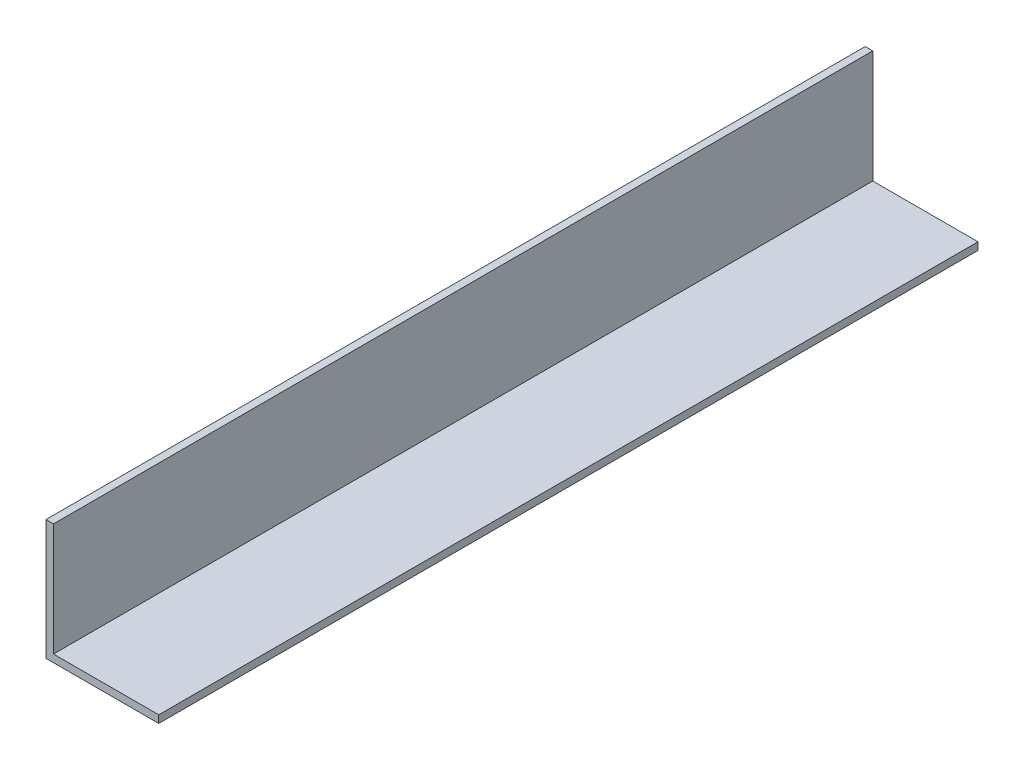
ISO-10303-21;
HEADER;
FILE_DESCRIPTION(('STEP AP214'),'2;1');
FILE_NAME('part.step','',(''),(''),'','','');
FILE_SCHEMA(('AUTOMOTIVE_DESIGN { 1 0 10303 214 1 1 1 1 }'));
ENDSEC;
DATA;
#1=APPLICATION_CONTEXT('core data for automotive mechanical design processes');
#2=APPLICATION_PROTOCOL_DEFINITION('international standard','automotive_design',2000,#1);
#3=PRODUCT_CONTEXT('',#1,'mechanical');
#4=PRODUCT('Part','Part','',(#3));
#5=PRODUCT_RELATED_PRODUCT_CATEGORY('part','',(#4));
#6=PRODUCT_DEFINITION_FORMATION('','',#4);
#7=PRODUCT_DEFINITION_CONTEXT('part definition',#1,'design');
#8=PRODUCT_DEFINITION('design','',#6,#7);
#9=PRODUCT_DEFINITION_SHAPE('','',#8);
#10=(LENGTH_UNIT() NAMED_UNIT(*) SI_UNIT(.MILLI.,.METRE.));
#11=(NAMED_UNIT(*) PLANE_ANGLE_UNIT() SI_UNIT($,.RADIAN.));
#12=(NAMED_UNIT(*) SI_UNIT($,.STERADIAN.) SOLID_ANGLE_UNIT());
#13=UNCERTAINTY_MEASURE_WITH_UNIT(LENGTH_MEASURE(1.E-05),#10,'distance_accuracy_value','');
#14=(GEOMETRIC_REPRESENTATION_CONTEXT(3) GLOBAL_UNCERTAINTY_ASSIGNED_CONTEXT((#13)) GLOBAL_UNIT_ASSIGNED_CONTEXT((#10,
#11,#12)) REPRESENTATION_CONTEXT('',''));
#15=CARTESIAN_POINT('',(0.,0.,0.));
#16=DIRECTION('',(0.,0.,1.));
#17=DIRECTION('',(1.,0.,0.));
#18=AXIS2_PLACEMENT_3D('',#15,#16,#17);
#19=CARTESIAN_POINT('',(30.,0.,218.));
#20=DIRECTION('',(0.,1.,0.));
#21=DIRECTION('',(-1.,0.,0.));
#22=AXIS2_PLACEMENT_3D('',#19,#20,#21);
#23=PLANE('',#22);
#24=DIRECTION('',(1.,0.,0.));
#25=VECTOR('',#24,1.);
#26=CARTESIAN_POINT('',(30.,0.,0.));
#27=LINE('',#26,#25);
#28=CARTESIAN_POINT('',(0.,0.,0.));
#29=VERTEX_POINT('',#28);
#30=CARTESIAN_POINT('',(30.,0.,0.));
#31=VERTEX_POINT('',#30);
#32=EDGE_CURVE('E134',#29,#31,#27,.T.);
#33=ORIENTED_EDGE('',*,*,#32,.T.);
#34=DIRECTION('',(0.,0.,-1.));
#35=VECTOR('',#34,1.);
#36=CARTESIAN_POINT('',(30.,0.,218.));
#37=LINE('',#36,#35);
#38=CARTESIAN_POINT('',(30.,0.,218.));
#39=VERTEX_POINT('',#38);
#40=EDGE_CURVE('E11',#39,#31,#37,.T.);
#41=ORIENTED_EDGE('',*,*,#40,.F.);
#42=DIRECTION('',(1.,0.,0.));
#43=VECTOR('',#42,1.);
#44=CARTESIAN_POINT('',(30.,0.,218.));
#45=LINE('',#44,#43);
#46=CARTESIAN_POINT('',(0.,0.,218.));
#47=VERTEX_POINT('',#46);
#48=EDGE_CURVE('E150',#47,#39,#45,.T.);
#49=ORIENTED_EDGE('',*,*,#48,.F.);
#50=DIRECTION('',(0.,0.,-1.));
#51=VECTOR('',#50,1.);
#52=CARTESIAN_POINT('',(0.,0.,218.));
#53=LINE('',#52,#51);
#54=EDGE_CURVE('E130',#47,#29,#53,.T.);
#55=ORIENTED_EDGE('',*,*,#54,.T.);
#56=EDGE_LOOP('',(#33,#41,#49,#55));
#57=FACE_BOUND('',#56,.T.);
#58=ADVANCED_FACE('F45',(#57),#23,.F.);
#59=CARTESIAN_POINT('',(30.,2.,218.));
#60=DIRECTION('',(-1.,0.,0.));
#61=DIRECTION('',(0.,0.,1.));
#62=AXIS2_PLACEMENT_3D('',#59,#60,#61);
#63=PLANE('',#62);
#64=DIRECTION('',(0.,1.,0.));
#65=VECTOR('',#64,1.);
#66=CARTESIAN_POINT('',(30.,2.,0.));
#67=LINE('',#66,#65);
#68=CARTESIAN_POINT('',(30.,2.,0.));
#69=VERTEX_POINT('',#68);
#70=EDGE_CURVE('E138',#31,#69,#67,.T.);
#71=ORIENTED_EDGE('',*,*,#70,.T.);
#72=DIRECTION('',(0.,0.,-1.));
#73=VECTOR('',#72,1.);
#74=CARTESIAN_POINT('',(30.,2.,218.));
#75=LINE('',#74,#73);
#76=CARTESIAN_POINT('',(30.,2.,218.));
#77=VERTEX_POINT('',#76);
#78=EDGE_CURVE('E54',#77,#69,#75,.T.);
#79=ORIENTED_EDGE('',*,*,#78,.F.);
#80=DIRECTION('',(0.,1.,0.));
#81=VECTOR('',#80,1.);
#82=CARTESIAN_POINT('',(30.,2.,218.));
#83=LINE('',#82,#81);
#84=EDGE_CURVE('E99',#39,#77,#83,.T.);
#85=ORIENTED_EDGE('',*,*,#84,.F.);
#86=ORIENTED_EDGE('',*,*,#40,.T.);
#87=EDGE_LOOP('',(#71,#79,#85,#86));
#88=FACE_BOUND('',#87,.T.);
#89=ADVANCED_FACE('F178',(#88),#63,.F.);
#90=CARTESIAN_POINT('',(2.,2.,218.));
#91=DIRECTION('',(0.,-1.,0.));
#92=DIRECTION('',(1.,0.,0.));
#93=AXIS2_PLACEMENT_3D('',#90,#91,#92);
#94=PLANE('',#93);
#95=DIRECTION('',(-1.,0.,0.));
#96=VECTOR('',#95,1.);
#97=CARTESIAN_POINT('',(2.,2.,0.));
#98=LINE('',#97,#96);
#99=CARTESIAN_POINT('',(2.,2.,0.));
#100=VERTEX_POINT('',#99);
#101=EDGE_CURVE('E141',#69,#100,#98,.T.);
#102=ORIENTED_EDGE('',*,*,#101,.T.);
#103=DIRECTION('',(0.,0.,-1.));
#104=VECTOR('',#103,1.);
#105=CARTESIAN_POINT('',(2.,2.,218.));
#106=LINE('',#105,#104);
#107=CARTESIAN_POINT('',(2.,2.,218.));
#108=VERTEX_POINT('',#107);
#109=EDGE_CURVE('E123',#108,#100,#106,.T.);
#110=ORIENTED_EDGE('',*,*,#109,.F.);
#111=DIRECTION('',(-1.,0.,0.));
#112=VECTOR('',#111,1.);
#113=CARTESIAN_POINT('',(2.,2.,218.));
#114=LINE('',#113,#112);
#115=EDGE_CURVE('E112',#77,#108,#114,.T.);
#116=ORIENTED_EDGE('',*,*,#115,.F.);
#117=ORIENTED_EDGE('',*,*,#78,.T.);
#118=EDGE_LOOP('',(#102,#110,#116,#117));
#119=FACE_BOUND('',#118,.T.);
#120=ADVANCED_FACE('F160',(#119),#94,.F.);
#121=CARTESIAN_POINT('',(1.99999999999999,32.,218.));
#122=DIRECTION('',(-1.,0.,0.));
#123=DIRECTION('',(0.,-1.,0.));
#124=AXIS2_PLACEMENT_3D('',#121,#122,#123);
#125=PLANE('',#124);
#126=DIRECTION('',(0.,1.,0.));
#127=VECTOR('',#126,1.);
#128=CARTESIAN_POINT('',(1.99999999999999,32.,0.));
#129=LINE('',#128,#127);
#130=CARTESIAN_POINT('',(1.99999999999999,32.,0.));
#131=VERTEX_POINT('',#130);
#132=EDGE_CURVE('E121',#100,#131,#129,.T.);
#133=ORIENTED_EDGE('',*,*,#132,.T.);
#134=DIRECTION('',(0.,0.,-1.));
#135=VECTOR('',#134,1.);
#136=CARTESIAN_POINT('',(1.99999999999999,32.,218.));
#137=LINE('',#136,#135);
#138=CARTESIAN_POINT('',(1.99999999999999,32.,218.));
#139=VERTEX_POINT('',#138);
#140=EDGE_CURVE('E118',#139,#131,#137,.T.);
#141=ORIENTED_EDGE('',*,*,#140,.F.);
#142=DIRECTION('',(0.,1.,0.));
#143=VECTOR('',#142,1.);
#144=CARTESIAN_POINT('',(1.99999999999999,32.,218.));
#145=LINE('',#144,#143);
#146=EDGE_CURVE('E106',#108,#139,#145,.T.);
#147=ORIENTED_EDGE('',*,*,#146,.F.);
#148=ORIENTED_EDGE('',*,*,#109,.T.);
#149=EDGE_LOOP('',(#133,#141,#147,#148));
#150=FACE_BOUND('',#149,.T.);
#151=ADVANCED_FACE('F119',(#150),#125,.F.);
#152=CARTESIAN_POINT('',(0.,32.,218.));
#153=DIRECTION('',(0.,-1.,0.));
#154=DIRECTION('',(0.,0.,-1.));
#155=AXIS2_PLACEMENT_3D('',#152,#153,#154);
#156=PLANE('',#155);
#157=DIRECTION('',(-1.,0.,0.));
#158=VECTOR('',#157,1.);
#159=CARTESIAN_POINT('',(0.,32.,0.));
#160=LINE('',#159,#158);
#161=CARTESIAN_POINT('',(0.,32.,0.));
#162=VERTEX_POINT('',#161);
#163=EDGE_CURVE('E85',#131,#162,#160,.T.);
#164=ORIENTED_EDGE('',*,*,#163,.T.);
#165=DIRECTION('',(0.,0.,-1.));
#166=VECTOR('',#165,1.);
#167=CARTESIAN_POINT('',(0.,32.,218.));
#168=LINE('',#167,#166);
#169=CARTESIAN_POINT('',(0.,32.,218.));
#170=VERTEX_POINT('',#169);
#171=EDGE_CURVE('E124',#170,#162,#168,.T.);
#172=ORIENTED_EDGE('',*,*,#171,.F.);
#173=DIRECTION('',(-1.,0.,0.));
#174=VECTOR('',#173,1.);
#175=CARTESIAN_POINT('',(0.,32.,218.));
#176=LINE('',#175,#174);
#177=EDGE_CURVE('E110',#139,#170,#176,.T.);
#178=ORIENTED_EDGE('',*,*,#177,.F.);
#179=ORIENTED_EDGE('',*,*,#140,.T.);
#180=EDGE_LOOP('',(#164,#172,#178,#179));
#181=FACE_BOUND('',#180,.T.);
#182=ADVANCED_FACE('F126',(#181),#156,.F.);
#183=CARTESIAN_POINT('',(0.,0.,218.));
#184=DIRECTION('',(1.,0.,0.));
#185=DIRECTION('',(0.,1.,0.));
#186=AXIS2_PLACEMENT_3D('',#183,#184,#185);
#187=PLANE('',#186);
#188=DIRECTION('',(0.,-1.,0.));
#189=VECTOR('',#188,1.);
#190=CARTESIAN_POINT('',(0.,0.,0.));
#191=LINE('',#190,#189);
#192=EDGE_CURVE('E91',#162,#29,#191,.T.);
#193=ORIENTED_EDGE('',*,*,#192,.T.);
#194=ORIENTED_EDGE('',*,*,#54,.F.);
#195=DIRECTION('',(0.,-1.,0.));
#196=VECTOR('',#195,1.);
#197=CARTESIAN_POINT('',(0.,0.,218.));
#198=LINE('',#197,#196);
#199=EDGE_CURVE('E62',#170,#47,#198,.T.);
#200=ORIENTED_EDGE('',*,*,#199,.F.);
#201=ORIENTED_EDGE('',*,*,#171,.T.);
#202=EDGE_LOOP('',(#193,#194,#200,#201));
#203=FACE_BOUND('',#202,.T.);
#204=ADVANCED_FACE('F167',(#203),#187,.F.);
#205=CARTESIAN_POINT('',(0.,0.,218.));
#206=DIRECTION('',(0.,0.,-1.));
#207=DIRECTION('',(-1.,0.,0.));
#208=AXIS2_PLACEMENT_3D('',#205,#206,#207);
#209=PLANE('',#208);
#210=ORIENTED_EDGE('',*,*,#48,.T.);
#211=ORIENTED_EDGE('',*,*,#84,.T.);
#212=ORIENTED_EDGE('',*,*,#115,.T.);
#213=ORIENTED_EDGE('',*,*,#146,.T.);
#214=ORIENTED_EDGE('',*,*,#177,.T.);
#215=ORIENTED_EDGE('',*,*,#199,.T.);
#216=EDGE_LOOP('',(#210,#211,#212,#213,#214,#215));
#217=FACE_BOUND('',#216,.T.);
#218=ADVANCED_FACE('F108',(#217),#209,.F.);
#219=CARTESIAN_POINT('',(0.,0.,0.));
#220=DIRECTION('',(0.,0.,-1.));
#221=DIRECTION('',(-1.,0.,0.));
#222=AXIS2_PLACEMENT_3D('',#219,#220,#221);
#223=PLANE('',#222);
#224=ORIENTED_EDGE('',*,*,#32,.F.);
#225=ORIENTED_EDGE('',*,*,#192,.F.);
#226=ORIENTED_EDGE('',*,*,#163,.F.);
#227=ORIENTED_EDGE('',*,*,#132,.F.);
#228=ORIENTED_EDGE('',*,*,#101,.F.);
#229=ORIENTED_EDGE('',*,*,#70,.F.);
#230=EDGE_LOOP('',(#224,#225,#226,#227,#228,#229));
#231=FACE_BOUND('',#230,.T.);
#232=ADVANCED_FACE('F163',(#231),#223,.T.);
#233=CLOSED_SHELL('',(#58,#89,#120,#151,#182,#204,#218,#232));
#234=MANIFOLD_SOLID_BREP('B2',#233);
#235=ADVANCED_BREP_SHAPE_REPRESENTATION('',(#18,#234),#14);
#236=SHAPE_DEFINITION_REPRESENTATION(#9,#235);
ENDSEC;
END-ISO-10303-21;
